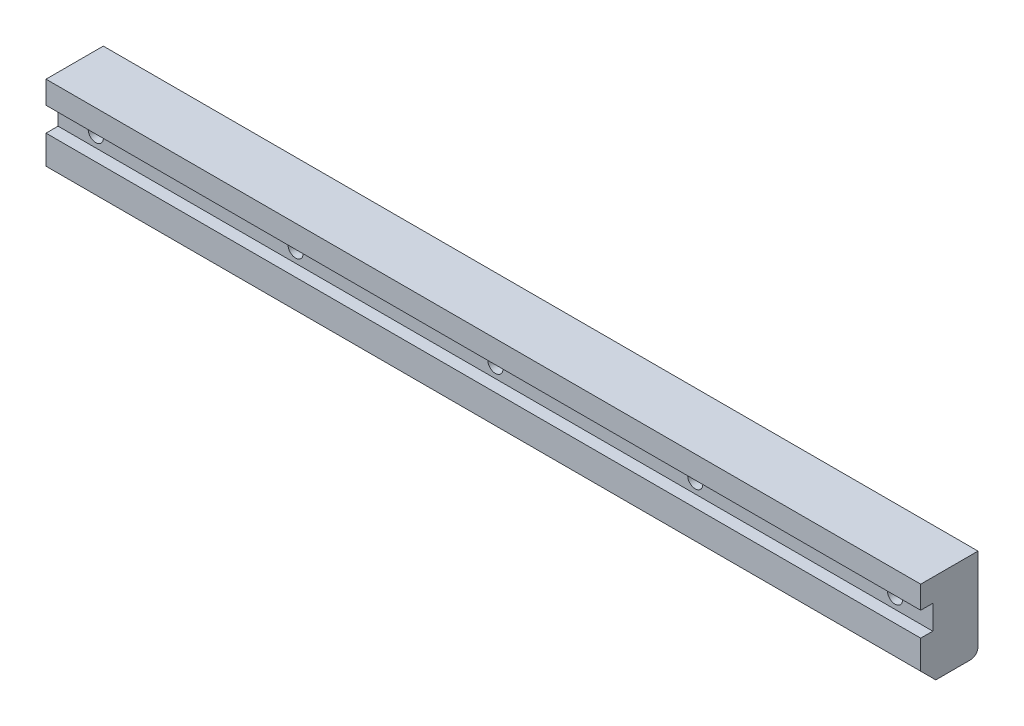
ISO-10303-21;
HEADER;
FILE_DESCRIPTION(('STEP AP214'),'2;1');
FILE_NAME('part.step','',(''),(''),'','','');
FILE_SCHEMA(('AUTOMOTIVE_DESIGN { 1 0 10303 214 1 1 1 1 }'));
ENDSEC;
DATA;
#1=APPLICATION_CONTEXT('core data for automotive mechanical design processes');
#2=APPLICATION_PROTOCOL_DEFINITION('international standard','automotive_design',2000,#1);
#3=PRODUCT_CONTEXT('',#1,'mechanical');
#4=PRODUCT('Part','Part','',(#3));
#5=PRODUCT_RELATED_PRODUCT_CATEGORY('part','',(#4));
#6=PRODUCT_DEFINITION_FORMATION('','',#4);
#7=PRODUCT_DEFINITION_CONTEXT('part definition',#1,'design');
#8=PRODUCT_DEFINITION('design','',#6,#7);
#9=PRODUCT_DEFINITION_SHAPE('','',#8);
#10=(LENGTH_UNIT() NAMED_UNIT(*) SI_UNIT(.MILLI.,.METRE.));
#11=(NAMED_UNIT(*) PLANE_ANGLE_UNIT() SI_UNIT($,.RADIAN.));
#12=(NAMED_UNIT(*) SI_UNIT($,.STERADIAN.) SOLID_ANGLE_UNIT());
#13=UNCERTAINTY_MEASURE_WITH_UNIT(LENGTH_MEASURE(1.E-05),#10,'distance_accuracy_value','');
#14=(GEOMETRIC_REPRESENTATION_CONTEXT(3) GLOBAL_UNCERTAINTY_ASSIGNED_CONTEXT((#13)) GLOBAL_UNIT_ASSIGNED_CONTEXT((#10,
#11,#12)) REPRESENTATION_CONTEXT('',''));
#15=CARTESIAN_POINT('',(0.,0.,0.));
#16=DIRECTION('',(0.,0.,1.));
#17=DIRECTION('',(1.,0.,0.));
#18=AXIS2_PLACEMENT_3D('',#15,#16,#17);
#19=CARTESIAN_POINT('',(580.,0.,-10.0000000000001));
#20=DIRECTION('',(0.,1.,0.));
#21=DIRECTION('',(0.,0.,1.));
#22=AXIS2_PLACEMENT_3D('',#19,#20,#21);
#23=PLANE('',#22);
#24=DIRECTION('',(0.,0.,-1.));
#25=VECTOR('',#24,1.);
#26=CARTESIAN_POINT('',(0.,0.,-10.0000000000001));
#27=LINE('',#26,#25);
#28=CARTESIAN_POINT('',(0.,0.,-10.0000000000001));
#29=VERTEX_POINT('',#28);
#30=CARTESIAN_POINT('',(0.,0.,-33.0000000000001));
#31=VERTEX_POINT('',#30);
#32=EDGE_CURVE('E149',#29,#31,#27,.T.);
#33=ORIENTED_EDGE('',*,*,#32,.T.);
#34=DIRECTION('',(-1.,0.,0.));
#35=VECTOR('',#34,1.);
#36=CARTESIAN_POINT('',(580.,0.,-33.0000000000001));
#37=LINE('',#36,#35);
#38=CARTESIAN_POINT('',(580.,0.,-33.0000000000001));
#39=VERTEX_POINT('',#38);
#40=EDGE_CURVE('E41',#31,#39,#37,.F.);
#41=ORIENTED_EDGE('',*,*,#40,.T.);
#42=DIRECTION('',(0.,0.,-1.));
#43=VECTOR('',#42,1.);
#44=CARTESIAN_POINT('',(580.,0.,-10.0000000000001));
#45=LINE('',#44,#43);
#46=CARTESIAN_POINT('',(580.,0.,-10.0000000000001));
#47=VERTEX_POINT('',#46);
#48=EDGE_CURVE('E119',#47,#39,#45,.T.);
#49=ORIENTED_EDGE('',*,*,#48,.F.);
#50=DIRECTION('',(-1.,0.,0.));
#51=VECTOR('',#50,1.);
#52=CARTESIAN_POINT('',(580.,0.,-10.0000000000001));
#53=LINE('',#52,#51);
#54=EDGE_CURVE('E148',#47,#29,#53,.T.);
#55=ORIENTED_EDGE('',*,*,#54,.T.);
#56=EDGE_LOOP('',(#33,#41,#49,#55));
#57=FACE_BOUND('',#56,.T.);
#58=ADVANCED_FACE('F33',(#57),#23,.F.);
#59=CARTESIAN_POINT('',(580.,0.,-38.0000000000001));
#60=DIRECTION('',(0.,0.,1.));
#61=DIRECTION('',(0.,-1.,0.));
#62=AXIS2_PLACEMENT_3D('',#59,#60,#61);
#63=PLANE('',#62);
#64=CARTESIAN_POINT('',(422.5,37.,-38.0000000000001));
#65=DIRECTION('',(0.,0.,1.));
#66=DIRECTION('',(0.,-1.,0.));
#67=AXIS2_PLACEMENT_3D('',#64,#65,#66);
#68=CIRCLE('',#67,4.99999999999999);
#69=CARTESIAN_POINT('',(422.5,32.,-38.0000000000001));
#70=VERTEX_POINT('',#69);
#71=EDGE_CURVE('E236',#70,#70,#68,.F.);
#72=ORIENTED_EDGE('',*,*,#71,.F.);
#73=EDGE_LOOP('',(#72));
#74=FACE_BOUND('',#73,.T.);
#75=CARTESIAN_POINT('',(290.,37.,-38.0000000000001));
#76=DIRECTION('',(0.,0.,1.));
#77=DIRECTION('',(0.,-1.,0.));
#78=AXIS2_PLACEMENT_3D('',#75,#76,#77);
#79=CIRCLE('',#78,4.99999999999999);
#80=CARTESIAN_POINT('',(290.,32.,-38.0000000000001));
#81=VERTEX_POINT('',#80);
#82=EDGE_CURVE('E231',#81,#81,#79,.F.);
#83=ORIENTED_EDGE('',*,*,#82,.F.);
#84=EDGE_LOOP('',(#83));
#85=FACE_BOUND('',#84,.T.);
#86=CARTESIAN_POINT('',(555.,37.,-38.0000000000001));
#87=DIRECTION('',(0.,0.,1.));
#88=DIRECTION('',(0.,-1.,0.));
#89=AXIS2_PLACEMENT_3D('',#86,#87,#88);
#90=CIRCLE('',#89,5.00000000000005);
#91=CARTESIAN_POINT('',(555.,32.,-38.0000000000001));
#92=VERTEX_POINT('',#91);
#93=EDGE_CURVE('E224',#92,#92,#90,.F.);
#94=ORIENTED_EDGE('',*,*,#93,.F.);
#95=EDGE_LOOP('',(#94));
#96=FACE_BOUND('',#95,.T.);
#97=CARTESIAN_POINT('',(157.5,37.,-38.0000000000001));
#98=DIRECTION('',(0.,0.,1.));
#99=DIRECTION('',(0.,-1.,0.));
#100=AXIS2_PLACEMENT_3D('',#97,#98,#99);
#101=CIRCLE('',#100,5.00000000000002);
#102=CARTESIAN_POINT('',(157.5,32.,-38.0000000000001));
#103=VERTEX_POINT('',#102);
#104=EDGE_CURVE('E223',#103,#103,#101,.F.);
#105=ORIENTED_EDGE('',*,*,#104,.F.);
#106=EDGE_LOOP('',(#105));
#107=FACE_BOUND('',#106,.T.);
#108=CARTESIAN_POINT('',(25.,37.,-38.0000000000001));
#109=DIRECTION('',(0.,0.,1.));
#110=DIRECTION('',(0.,-1.,0.));
#111=AXIS2_PLACEMENT_3D('',#108,#109,#110);
#112=CIRCLE('',#111,5.);
#113=CARTESIAN_POINT('',(25.,32.,-38.0000000000001));
#114=VERTEX_POINT('',#113);
#115=EDGE_CURVE('E151',#114,#114,#112,.F.);
#116=ORIENTED_EDGE('',*,*,#115,.F.);
#117=EDGE_LOOP('',(#116));
#118=FACE_BOUND('',#117,.T.);
#119=DIRECTION('',(0.,1.,0.));
#120=VECTOR('',#119,1.);
#121=CARTESIAN_POINT('',(580.,0.,-38.0000000000001));
#122=LINE('',#121,#120);
#123=CARTESIAN_POINT('',(580.,5.00000000000001,-38.0000000000001));
#124=VERTEX_POINT('',#123);
#125=CARTESIAN_POINT('',(580.,60.,-38.0000000000001));
#126=VERTEX_POINT('',#125);
#127=EDGE_CURVE('E109',#124,#126,#122,.T.);
#128=ORIENTED_EDGE('',*,*,#127,.F.);
#129=DIRECTION('',(-1.,0.,0.));
#130=VECTOR('',#129,1.);
#131=CARTESIAN_POINT('',(580.,5.00000000000001,-38.0000000000001));
#132=LINE('',#131,#130);
#133=CARTESIAN_POINT('',(0.,5.00000000000001,-38.0000000000001));
#134=VERTEX_POINT('',#133);
#135=EDGE_CURVE('E127',#124,#134,#132,.T.);
#136=ORIENTED_EDGE('',*,*,#135,.T.);
#137=DIRECTION('',(0.,1.,0.));
#138=VECTOR('',#137,1.);
#139=CARTESIAN_POINT('',(0.,0.,-38.0000000000001));
#140=LINE('',#139,#138);
#141=CARTESIAN_POINT('',(0.,60.,-38.0000000000001));
#142=VERTEX_POINT('',#141);
#143=EDGE_CURVE('E124',#134,#142,#140,.T.);
#144=ORIENTED_EDGE('',*,*,#143,.T.);
#145=DIRECTION('',(-1.,0.,0.));
#146=VECTOR('',#145,1.);
#147=CARTESIAN_POINT('',(580.,60.,-38.0000000000001));
#148=LINE('',#147,#146);
#149=EDGE_CURVE('E122',#126,#142,#148,.T.);
#150=ORIENTED_EDGE('',*,*,#149,.F.);
#151=EDGE_LOOP('',(#128,#136,#144,#150));
#152=FACE_BOUND('',#151,.T.);
#153=ADVANCED_FACE('F123',(#74,#85,#96,#107,#118,#152),#63,.F.);
#154=CARTESIAN_POINT('',(580.,60.,0.));
#155=DIRECTION('',(0.,-1.,0.));
#156=DIRECTION('',(0.,0.,-1.));
#157=AXIS2_PLACEMENT_3D('',#154,#155,#156);
#158=PLANE('',#157);
#159=DIRECTION('',(0.,0.,1.));
#160=VECTOR('',#159,1.);
#161=CARTESIAN_POINT('',(0.,60.,0.));
#162=LINE('',#161,#160);
#163=CARTESIAN_POINT('',(0.,60.,0.));
#164=VERTEX_POINT('',#163);
#165=EDGE_CURVE('E153',#142,#164,#162,.T.);
#166=ORIENTED_EDGE('',*,*,#165,.T.);
#167=DIRECTION('',(-1.,0.,0.));
#168=VECTOR('',#167,1.);
#169=CARTESIAN_POINT('',(580.,60.,0.));
#170=LINE('',#169,#168);
#171=CARTESIAN_POINT('',(580.,60.,0.));
#172=VERTEX_POINT('',#171);
#173=EDGE_CURVE('E128',#172,#164,#170,.T.);
#174=ORIENTED_EDGE('',*,*,#173,.F.);
#175=DIRECTION('',(0.,0.,1.));
#176=VECTOR('',#175,1.);
#177=CARTESIAN_POINT('',(580.,60.,0.));
#178=LINE('',#177,#176);
#179=EDGE_CURVE('E113',#126,#172,#178,.T.);
#180=ORIENTED_EDGE('',*,*,#179,.F.);
#181=ORIENTED_EDGE('',*,*,#149,.T.);
#182=EDGE_LOOP('',(#166,#174,#180,#181));
#183=FACE_BOUND('',#182,.T.);
#184=ADVANCED_FACE('F130',(#183),#158,.F.);
#185=CARTESIAN_POINT('',(580.,45.,0.));
#186=DIRECTION('',(0.,0.,-1.));
#187=DIRECTION('',(-1.,0.,0.));
#188=AXIS2_PLACEMENT_3D('',#185,#186,#187);
#189=PLANE('',#188);
#190=DIRECTION('',(0.,-1.,0.));
#191=VECTOR('',#190,1.);
#192=CARTESIAN_POINT('',(0.,45.,0.));
#193=LINE('',#192,#191);
#194=CARTESIAN_POINT('',(0.,45.,0.));
#195=VERTEX_POINT('',#194);
#196=EDGE_CURVE('E155',#164,#195,#193,.T.);
#197=ORIENTED_EDGE('',*,*,#196,.T.);
#198=DIRECTION('',(-1.,0.,0.));
#199=VECTOR('',#198,1.);
#200=CARTESIAN_POINT('',(580.,45.,0.));
#201=LINE('',#200,#199);
#202=CARTESIAN_POINT('',(580.,45.,0.));
#203=VERTEX_POINT('',#202);
#204=EDGE_CURVE('E181',#203,#195,#201,.T.);
#205=ORIENTED_EDGE('',*,*,#204,.F.);
#206=DIRECTION('',(0.,-1.,0.));
#207=VECTOR('',#206,1.);
#208=CARTESIAN_POINT('',(580.,45.,0.));
#209=LINE('',#208,#207);
#210=EDGE_CURVE('E133',#172,#203,#209,.T.);
#211=ORIENTED_EDGE('',*,*,#210,.F.);
#212=ORIENTED_EDGE('',*,*,#173,.T.);
#213=EDGE_LOOP('',(#197,#205,#211,#212));
#214=FACE_BOUND('',#213,.T.);
#215=ADVANCED_FACE('F191',(#214),#189,.F.);
#216=CARTESIAN_POINT('',(580.,45.,-8.));
#217=DIRECTION('',(0.,1.,0.));
#218=DIRECTION('',(0.,0.,1.));
#219=AXIS2_PLACEMENT_3D('',#216,#217,#218);
#220=PLANE('',#219);
#221=DIRECTION('',(0.,0.,-1.));
#222=VECTOR('',#221,1.);
#223=CARTESIAN_POINT('',(0.,45.,-8.));
#224=LINE('',#223,#222);
#225=CARTESIAN_POINT('',(0.,45.,-8.));
#226=VERTEX_POINT('',#225);
#227=EDGE_CURVE('E157',#195,#226,#224,.T.);
#228=ORIENTED_EDGE('',*,*,#227,.T.);
#229=DIRECTION('',(-1.,0.,0.));
#230=VECTOR('',#229,1.);
#231=CARTESIAN_POINT('',(580.,45.,-8.));
#232=LINE('',#231,#230);
#233=CARTESIAN_POINT('',(580.,45.,-8.));
#234=VERTEX_POINT('',#233);
#235=EDGE_CURVE('E178',#234,#226,#232,.T.);
#236=ORIENTED_EDGE('',*,*,#235,.F.);
#237=DIRECTION('',(0.,0.,-1.));
#238=VECTOR('',#237,1.);
#239=CARTESIAN_POINT('',(580.,45.,-8.));
#240=LINE('',#239,#238);
#241=EDGE_CURVE('E135',#203,#234,#240,.T.);
#242=ORIENTED_EDGE('',*,*,#241,.F.);
#243=ORIENTED_EDGE('',*,*,#204,.T.);
#244=EDGE_LOOP('',(#228,#236,#242,#243));
#245=FACE_BOUND('',#244,.T.);
#246=ADVANCED_FACE('F198',(#245),#220,.F.);
#247=CARTESIAN_POINT('',(580.,29.,-8.));
#248=DIRECTION('',(0.,0.,-1.));
#249=DIRECTION('',(-1.,0.,0.));
#250=AXIS2_PLACEMENT_3D('',#247,#248,#249);
#251=PLANE('',#250);
#252=CARTESIAN_POINT('',(422.5,37.,-8.));
#253=DIRECTION('',(0.,0.,1.));
#254=DIRECTION('',(1.,0.,0.));
#255=AXIS2_PLACEMENT_3D('',#252,#253,#254);
#256=CIRCLE('',#255,4.99999999999999);
#257=CARTESIAN_POINT('',(427.5,37.,-8.));
#258=VERTEX_POINT('',#257);
#259=EDGE_CURVE('E240',#258,#258,#256,.T.);
#260=ORIENTED_EDGE('',*,*,#259,.F.);
#261=EDGE_LOOP('',(#260));
#262=FACE_BOUND('',#261,.T.);
#263=CARTESIAN_POINT('',(290.,37.,-8.));
#264=DIRECTION('',(0.,0.,1.));
#265=DIRECTION('',(1.,0.,0.));
#266=AXIS2_PLACEMENT_3D('',#263,#264,#265);
#267=CIRCLE('',#266,4.99999999999999);
#268=CARTESIAN_POINT('',(295.,37.,-8.));
#269=VERTEX_POINT('',#268);
#270=EDGE_CURVE('E239',#269,#269,#267,.T.);
#271=ORIENTED_EDGE('',*,*,#270,.F.);
#272=EDGE_LOOP('',(#271));
#273=FACE_BOUND('',#272,.T.);
#274=CARTESIAN_POINT('',(555.,37.,-8.));
#275=DIRECTION('',(0.,0.,1.));
#276=DIRECTION('',(1.,0.,0.));
#277=AXIS2_PLACEMENT_3D('',#274,#275,#276);
#278=CIRCLE('',#277,5.00000000000005);
#279=CARTESIAN_POINT('',(560.,37.,-8.));
#280=VERTEX_POINT('',#279);
#281=EDGE_CURVE('E228',#280,#280,#278,.T.);
#282=ORIENTED_EDGE('',*,*,#281,.F.);
#283=EDGE_LOOP('',(#282));
#284=FACE_BOUND('',#283,.T.);
#285=CARTESIAN_POINT('',(157.5,37.,-8.));
#286=DIRECTION('',(0.,0.,1.));
#287=DIRECTION('',(1.,0.,0.));
#288=AXIS2_PLACEMENT_3D('',#285,#286,#287);
#289=CIRCLE('',#288,5.00000000000002);
#290=CARTESIAN_POINT('',(162.5,37.,-8.));
#291=VERTEX_POINT('',#290);
#292=EDGE_CURVE('E227',#291,#291,#289,.T.);
#293=ORIENTED_EDGE('',*,*,#292,.F.);
#294=EDGE_LOOP('',(#293));
#295=FACE_BOUND('',#294,.T.);
#296=CARTESIAN_POINT('',(25.,37.,-8.));
#297=DIRECTION('',(0.,0.,1.));
#298=DIRECTION('',(1.,0.,0.));
#299=AXIS2_PLACEMENT_3D('',#296,#297,#298);
#300=CIRCLE('',#299,5.);
#301=CARTESIAN_POINT('',(30.,37.,-8.));
#302=VERTEX_POINT('',#301);
#303=EDGE_CURVE('E220',#302,#302,#300,.T.);
#304=ORIENTED_EDGE('',*,*,#303,.F.);
#305=EDGE_LOOP('',(#304));
#306=FACE_BOUND('',#305,.T.);
#307=DIRECTION('',(0.,-1.,0.));
#308=VECTOR('',#307,1.);
#309=CARTESIAN_POINT('',(0.,29.,-8.));
#310=LINE('',#309,#308);
#311=CARTESIAN_POINT('',(0.,29.,-8.));
#312=VERTEX_POINT('',#311);
#313=EDGE_CURVE('E159',#226,#312,#310,.T.);
#314=ORIENTED_EDGE('',*,*,#313,.T.);
#315=DIRECTION('',(-1.,0.,0.));
#316=VECTOR('',#315,1.);
#317=CARTESIAN_POINT('',(580.,29.,-8.));
#318=LINE('',#317,#316);
#319=CARTESIAN_POINT('',(580.,29.,-8.));
#320=VERTEX_POINT('',#319);
#321=EDGE_CURVE('E175',#320,#312,#318,.T.);
#322=ORIENTED_EDGE('',*,*,#321,.F.);
#323=DIRECTION('',(0.,-1.,0.));
#324=VECTOR('',#323,1.);
#325=CARTESIAN_POINT('',(580.,29.,-8.));
#326=LINE('',#325,#324);
#327=EDGE_CURVE('E140',#234,#320,#326,.T.);
#328=ORIENTED_EDGE('',*,*,#327,.F.);
#329=ORIENTED_EDGE('',*,*,#235,.T.);
#330=EDGE_LOOP('',(#314,#322,#328,#329));
#331=FACE_BOUND('',#330,.T.);
#332=ADVANCED_FACE('F201',(#262,#273,#284,#295,#306,#331),#251,.F.);
#333=CARTESIAN_POINT('',(580.,29.,0.));
#334=DIRECTION('',(0.,-1.,0.));
#335=DIRECTION('',(0.,0.,-1.));
#336=AXIS2_PLACEMENT_3D('',#333,#334,#335);
#337=PLANE('',#336);
#338=DIRECTION('',(0.,0.,1.));
#339=VECTOR('',#338,1.);
#340=CARTESIAN_POINT('',(0.,29.,0.));
#341=LINE('',#340,#339);
#342=CARTESIAN_POINT('',(0.,29.,0.));
#343=VERTEX_POINT('',#342);
#344=EDGE_CURVE('E161',#312,#343,#341,.T.);
#345=ORIENTED_EDGE('',*,*,#344,.T.);
#346=DIRECTION('',(-1.,0.,0.));
#347=VECTOR('',#346,1.);
#348=CARTESIAN_POINT('',(580.,29.,0.));
#349=LINE('',#348,#347);
#350=CARTESIAN_POINT('',(580.,29.,0.));
#351=VERTEX_POINT('',#350);
#352=EDGE_CURVE('E172',#351,#343,#349,.T.);
#353=ORIENTED_EDGE('',*,*,#352,.F.);
#354=DIRECTION('',(0.,0.,1.));
#355=VECTOR('',#354,1.);
#356=CARTESIAN_POINT('',(580.,29.,0.));
#357=LINE('',#356,#355);
#358=EDGE_CURVE('E142',#320,#351,#357,.T.);
#359=ORIENTED_EDGE('',*,*,#358,.F.);
#360=ORIENTED_EDGE('',*,*,#321,.T.);
#361=EDGE_LOOP('',(#345,#353,#359,#360));
#362=FACE_BOUND('',#361,.T.);
#363=ADVANCED_FACE('F206',(#362),#337,.F.);
#364=CARTESIAN_POINT('',(580.,10.,0.));
#365=DIRECTION('',(0.,0.,-1.));
#366=DIRECTION('',(-1.,0.,0.));
#367=AXIS2_PLACEMENT_3D('',#364,#365,#366);
#368=PLANE('',#367);
#369=DIRECTION('',(0.,-1.,0.));
#370=VECTOR('',#369,1.);
#371=CARTESIAN_POINT('',(0.,10.,0.));
#372=LINE('',#371,#370);
#373=CARTESIAN_POINT('',(0.,10.,0.));
#374=VERTEX_POINT('',#373);
#375=EDGE_CURVE('E163',#343,#374,#372,.T.);
#376=ORIENTED_EDGE('',*,*,#375,.T.);
#377=DIRECTION('',(-1.,0.,0.));
#378=VECTOR('',#377,1.);
#379=CARTESIAN_POINT('',(580.,10.,0.));
#380=LINE('',#379,#378);
#381=CARTESIAN_POINT('',(580.,10.,0.));
#382=VERTEX_POINT('',#381);
#383=EDGE_CURVE('E169',#382,#374,#380,.T.);
#384=ORIENTED_EDGE('',*,*,#383,.F.);
#385=DIRECTION('',(0.,-1.,0.));
#386=VECTOR('',#385,1.);
#387=CARTESIAN_POINT('',(580.,10.,0.));
#388=LINE('',#387,#386);
#389=EDGE_CURVE('E144',#351,#382,#388,.T.);
#390=ORIENTED_EDGE('',*,*,#389,.F.);
#391=ORIENTED_EDGE('',*,*,#352,.T.);
#392=EDGE_LOOP('',(#376,#384,#390,#391));
#393=FACE_BOUND('',#392,.T.);
#394=ADVANCED_FACE('F212',(#393),#368,.F.);
#395=CARTESIAN_POINT('',(580.,0.,-10.0000000000001));
#396=DIRECTION('',(0.,0.707106781186551,-0.707106781186544));
#397=DIRECTION('',(0.,0.707106781186544,0.707106781186551));
#398=AXIS2_PLACEMENT_3D('',#395,#396,#397);
#399=PLANE('',#398);
#400=DIRECTION('',(0.,-0.707106781186544,-0.707106781186551));
#401=VECTOR('',#400,1.);
#402=CARTESIAN_POINT('',(0.,0.,-10.0000000000001));
#403=LINE('',#402,#401);
#404=EDGE_CURVE('E165',#374,#29,#403,.T.);
#405=ORIENTED_EDGE('',*,*,#404,.T.);
#406=ORIENTED_EDGE('',*,*,#54,.F.);
#407=DIRECTION('',(0.,-0.707106781186544,-0.707106781186551));
#408=VECTOR('',#407,1.);
#409=CARTESIAN_POINT('',(580.,0.,-10.0000000000001));
#410=LINE('',#409,#408);
#411=EDGE_CURVE('E146',#382,#47,#410,.T.);
#412=ORIENTED_EDGE('',*,*,#411,.F.);
#413=ORIENTED_EDGE('',*,*,#383,.T.);
#414=EDGE_LOOP('',(#405,#406,#412,#413));
#415=FACE_BOUND('',#414,.T.);
#416=ADVANCED_FACE('F216',(#415),#399,.F.);
#417=CARTESIAN_POINT('',(580.,0.,0.));
#418=DIRECTION('',(1.,0.,0.));
#419=DIRECTION('',(0.,0.,-1.));
#420=AXIS2_PLACEMENT_3D('',#417,#418,#419);
#421=PLANE('',#420);
#422=ORIENTED_EDGE('',*,*,#48,.T.);
#423=CARTESIAN_POINT('',(580.,5.00000000000001,-33.0000000000001));
#424=DIRECTION('',(1.,0.,0.));
#425=DIRECTION('',(0.,0.,-1.));
#426=AXIS2_PLACEMENT_3D('',#423,#424,#425);
#427=CIRCLE('',#426,5.);
#428=EDGE_CURVE('E11',#39,#124,#427,.T.);
#429=ORIENTED_EDGE('',*,*,#428,.T.);
#430=ORIENTED_EDGE('',*,*,#127,.T.);
#431=ORIENTED_EDGE('',*,*,#179,.T.);
#432=ORIENTED_EDGE('',*,*,#210,.T.);
#433=ORIENTED_EDGE('',*,*,#241,.T.);
#434=ORIENTED_EDGE('',*,*,#327,.T.);
#435=ORIENTED_EDGE('',*,*,#358,.T.);
#436=ORIENTED_EDGE('',*,*,#389,.T.);
#437=ORIENTED_EDGE('',*,*,#411,.T.);
#438=EDGE_LOOP('',(#422,#429,#430,#431,#432,#433,#434,#435,#436,#437));
#439=FACE_BOUND('',#438,.T.);
#440=ADVANCED_FACE('F111',(#439),#421,.T.);
#441=CARTESIAN_POINT('',(0.,0.,0.));
#442=DIRECTION('',(1.,0.,0.));
#443=DIRECTION('',(0.,0.,-1.));
#444=AXIS2_PLACEMENT_3D('',#441,#442,#443);
#445=PLANE('',#444);
#446=ORIENTED_EDGE('',*,*,#143,.F.);
#447=CARTESIAN_POINT('',(0.,5.00000000000001,-33.0000000000001));
#448=DIRECTION('',(1.,0.,0.));
#449=DIRECTION('',(0.,0.,-1.));
#450=AXIS2_PLACEMENT_3D('',#447,#448,#449);
#451=CIRCLE('',#450,5.);
#452=EDGE_CURVE('E55',#134,#31,#451,.F.);
#453=ORIENTED_EDGE('',*,*,#452,.T.);
#454=ORIENTED_EDGE('',*,*,#32,.F.);
#455=ORIENTED_EDGE('',*,*,#404,.F.);
#456=ORIENTED_EDGE('',*,*,#375,.F.);
#457=ORIENTED_EDGE('',*,*,#344,.F.);
#458=ORIENTED_EDGE('',*,*,#313,.F.);
#459=ORIENTED_EDGE('',*,*,#227,.F.);
#460=ORIENTED_EDGE('',*,*,#196,.F.);
#461=ORIENTED_EDGE('',*,*,#165,.F.);
#462=EDGE_LOOP('',(#446,#453,#454,#455,#456,#457,#458,#459,#460,#461));
#463=FACE_BOUND('',#462,.T.);
#464=ADVANCED_FACE('F187',(#463),#445,.F.);
#465=CARTESIAN_POINT('',(580.,5.00000000000001,-33.0000000000001));
#466=DIRECTION('',(-1.,0.,0.));
#467=DIRECTION('',(0.,0.,1.));
#468=AXIS2_PLACEMENT_3D('',#465,#466,#467);
#469=CYLINDRICAL_SURFACE('',#468,5.);
#470=ORIENTED_EDGE('',*,*,#428,.F.);
#471=ORIENTED_EDGE('',*,*,#40,.F.);
#472=ORIENTED_EDGE('',*,*,#452,.F.);
#473=ORIENTED_EDGE('',*,*,#135,.F.);
#474=EDGE_LOOP('',(#470,#471,#472,#473));
#475=FACE_BOUND('',#474,.T.);
#476=ADVANCED_FACE('F35',(#475),#469,.T.);
#477=CARTESIAN_POINT('',(25.,37.,-38.0010000000001));
#478=DIRECTION('',(0.,0.,1.));
#479=DIRECTION('',(1.,0.,0.));
#480=AXIS2_PLACEMENT_3D('',#477,#478,#479);
#481=CYLINDRICAL_SURFACE('',#480,5.);
#482=ORIENTED_EDGE('',*,*,#303,.T.);
#483=EDGE_LOOP('',(#482));
#484=FACE_BOUND('',#483,.T.);
#485=ORIENTED_EDGE('',*,*,#115,.T.);
#486=EDGE_LOOP('',(#485));
#487=FACE_BOUND('',#486,.T.);
#488=ADVANCED_FACE('F261',(#484,#487),#481,.F.);
#489=CARTESIAN_POINT('',(157.5,37.,-38.0010000000001));
#490=DIRECTION('',(0.,0.,1.));
#491=DIRECTION('',(1.,0.,0.));
#492=AXIS2_PLACEMENT_3D('',#489,#490,#491);
#493=CYLINDRICAL_SURFACE('',#492,5.00000000000002);
#494=ORIENTED_EDGE('',*,*,#292,.T.);
#495=EDGE_LOOP('',(#494));
#496=FACE_BOUND('',#495,.T.);
#497=ORIENTED_EDGE('',*,*,#104,.T.);
#498=EDGE_LOOP('',(#497));
#499=FACE_BOUND('',#498,.T.);
#500=ADVANCED_FACE('F264',(#496,#499),#493,.F.);
#501=CARTESIAN_POINT('',(555.,37.,-38.0010000000001));
#502=DIRECTION('',(0.,0.,1.));
#503=DIRECTION('',(1.,0.,0.));
#504=AXIS2_PLACEMENT_3D('',#501,#502,#503);
#505=CYLINDRICAL_SURFACE('',#504,5.00000000000005);
#506=ORIENTED_EDGE('',*,*,#281,.T.);
#507=EDGE_LOOP('',(#506));
#508=FACE_BOUND('',#507,.T.);
#509=ORIENTED_EDGE('',*,*,#93,.T.);
#510=EDGE_LOOP('',(#509));
#511=FACE_BOUND('',#510,.T.);
#512=ADVANCED_FACE('F293',(#508,#511),#505,.F.);
#513=CARTESIAN_POINT('',(290.,37.,-38.0010000000001));
#514=DIRECTION('',(0.,0.,1.));
#515=DIRECTION('',(1.,0.,0.));
#516=AXIS2_PLACEMENT_3D('',#513,#514,#515);
#517=CYLINDRICAL_SURFACE('',#516,4.99999999999999);
#518=ORIENTED_EDGE('',*,*,#270,.T.);
#519=EDGE_LOOP('',(#518));
#520=FACE_BOUND('',#519,.T.);
#521=ORIENTED_EDGE('',*,*,#82,.T.);
#522=EDGE_LOOP('',(#521));
#523=FACE_BOUND('',#522,.T.);
#524=ADVANCED_FACE('F248',(#520,#523),#517,.F.);
#525=CARTESIAN_POINT('',(422.5,37.,-38.0010000000001));
#526=DIRECTION('',(0.,0.,1.));
#527=DIRECTION('',(1.,0.,0.));
#528=AXIS2_PLACEMENT_3D('',#525,#526,#527);
#529=CYLINDRICAL_SURFACE('',#528,4.99999999999999);
#530=ORIENTED_EDGE('',*,*,#259,.T.);
#531=EDGE_LOOP('',(#530));
#532=FACE_BOUND('',#531,.T.);
#533=ORIENTED_EDGE('',*,*,#71,.T.);
#534=EDGE_LOOP('',(#533));
#535=FACE_BOUND('',#534,.T.);
#536=ADVANCED_FACE('F300',(#532,#535),#529,.F.);
#537=CLOSED_SHELL('',(#58,#153,#184,#215,#246,#332,#363,#394,#416,#440,#464,#476,#488,#500,#512,
#524,#536));
#538=MANIFOLD_SOLID_BREP('B2',#537);
#539=ADVANCED_BREP_SHAPE_REPRESENTATION('',(#18,#538),#14);
#540=SHAPE_DEFINITION_REPRESENTATION(#9,#539);
ENDSEC;
END-ISO-10303-21;
